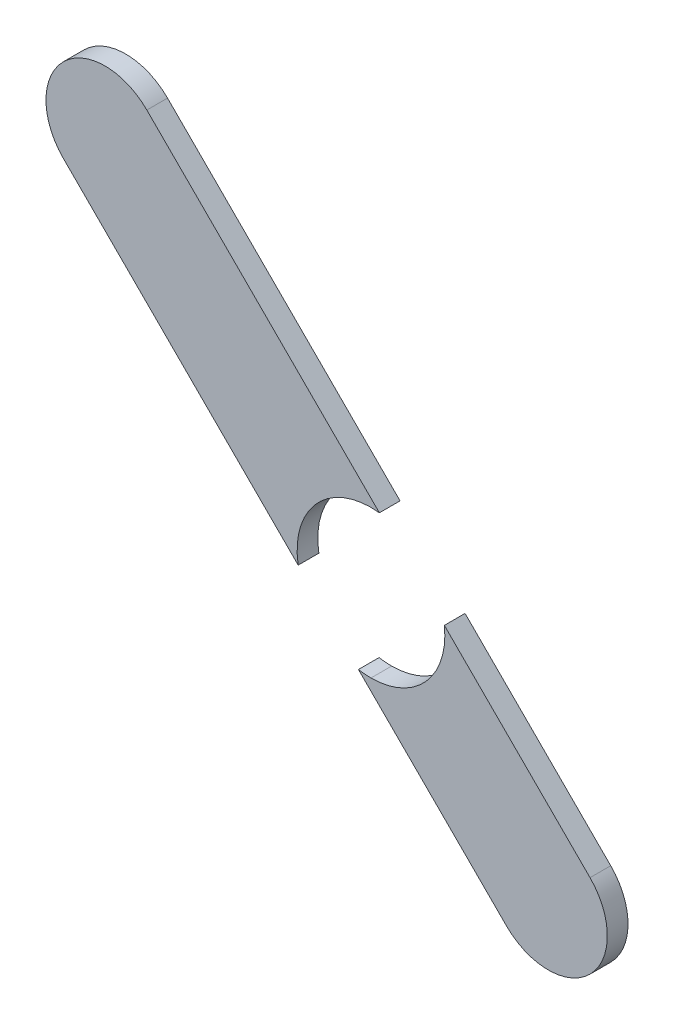
ISO-10303-21;
HEADER;
FILE_DESCRIPTION(('STEP AP214'),'2;1');
FILE_NAME('part.step','',(''),(''),'','','');
FILE_SCHEMA(('AUTOMOTIVE_DESIGN { 1 0 10303 214 1 1 1 1 }'));
ENDSEC;
DATA;
#1=APPLICATION_CONTEXT('core data for automotive mechanical design processes');
#2=APPLICATION_PROTOCOL_DEFINITION('international standard','automotive_design',2000,#1);
#3=PRODUCT_CONTEXT('',#1,'mechanical');
#4=PRODUCT('Part','Part','',(#3));
#5=PRODUCT_RELATED_PRODUCT_CATEGORY('part','',(#4));
#6=PRODUCT_DEFINITION_FORMATION('','',#4);
#7=PRODUCT_DEFINITION_CONTEXT('part definition',#1,'design');
#8=PRODUCT_DEFINITION('design','',#6,#7);
#9=PRODUCT_DEFINITION_SHAPE('','',#8);
#10=(LENGTH_UNIT() NAMED_UNIT(*) SI_UNIT(.MILLI.,.METRE.));
#11=(NAMED_UNIT(*) PLANE_ANGLE_UNIT() SI_UNIT($,.RADIAN.));
#12=(NAMED_UNIT(*) SI_UNIT($,.STERADIAN.) SOLID_ANGLE_UNIT());
#13=UNCERTAINTY_MEASURE_WITH_UNIT(LENGTH_MEASURE(1.E-05),#10,'distance_accuracy_value','');
#14=(GEOMETRIC_REPRESENTATION_CONTEXT(3) GLOBAL_UNCERTAINTY_ASSIGNED_CONTEXT((#13)) GLOBAL_UNIT_ASSIGNED_CONTEXT((#10,
#11,#12)) REPRESENTATION_CONTEXT('',''));
#15=CARTESIAN_POINT('',(0.,0.,0.));
#16=DIRECTION('',(0.,0.,1.));
#17=DIRECTION('',(1.,0.,0.));
#18=AXIS2_PLACEMENT_3D('',#15,#16,#17);
#19=CARTESIAN_POINT('',(150.5,-116.46,-0.045));
#20=DIRECTION('',(0.,0.,-1.));
#21=DIRECTION('',(0.,-1.,0.));
#22=AXIS2_PLACEMENT_3D('',#19,#20,#21);
#23=CYLINDRICAL_SURFACE('',#22,0.125);
#24=DIRECTION('',(0.,0.,1.));
#25=VECTOR('',#24,1.);
#26=CARTESIAN_POINT('',(150.5,-116.585,-0.045));
#27=LINE('',#26,#25);
#28=CARTESIAN_POINT('',(150.5,-116.585,1.6));
#29=VERTEX_POINT('',#28);
#30=CARTESIAN_POINT('',(150.5,-116.585,1.635));
#31=VERTEX_POINT('',#30);
#32=EDGE_CURVE('P0_E50',#29,#31,#27,.T.);
#33=ORIENTED_EDGE('',*,*,#32,.F.);
#34=CARTESIAN_POINT('',(150.5,-116.46,1.6));
#35=DIRECTION('',(0.,0.,-1.));
#36=DIRECTION('',(0.,-1.,0.));
#37=AXIS2_PLACEMENT_3D('',#34,#35,#36);
#38=CIRCLE('',#37,0.125);
#39=CARTESIAN_POINT('',(150.47876148928,-116.5831824892,1.6));
#40=VERTEX_POINT('',#39);
#41=EDGE_CURVE('P0_E91',#29,#40,#38,.T.);
#42=ORIENTED_EDGE('',*,*,#41,.T.);
#43=DIRECTION('',(0.,0.,-1.));
#44=VECTOR('',#43,1.);
#45=CARTESIAN_POINT('',(150.47876148926,-116.5831824892,-0.045));
#46=LINE('',#45,#44);
#47=CARTESIAN_POINT('',(150.47876148928,-116.5831824892,1.635));
#48=VERTEX_POINT('',#47);
#49=EDGE_CURVE('P0_E11',#48,#40,#46,.T.);
#50=ORIENTED_EDGE('',*,*,#49,.F.);
#51=CARTESIAN_POINT('',(150.5,-116.46,1.635));
#52=DIRECTION('',(0.,0.,-1.));
#53=DIRECTION('',(0.,-1.,0.));
#54=AXIS2_PLACEMENT_3D('',#51,#52,#53);
#55=CIRCLE('',#54,0.125);
#56=EDGE_CURVE('P0_E133',#31,#48,#55,.T.);
#57=ORIENTED_EDGE('',*,*,#56,.F.);
#58=EDGE_LOOP('',(#33,#42,#50,#57));
#59=FACE_BOUND('',#58,.T.);
#60=ADVANCED_FACE('P0_F17',(#59),#23,.F.);
#61=CARTESIAN_POINT('',(149.979289,-116.08371,1.6));
#62=DIRECTION('',(0.707106781186548,0.707106781186548,0.));
#63=DIRECTION('',(0.,0.,-1.));
#64=AXIS2_PLACEMENT_3D('',#61,#62,#63);
#65=PLANE('',#64);
#66=DIRECTION('',(0.,0.,1.));
#67=VECTOR('',#66,1.);
#68=CARTESIAN_POINT('',(150.729289,-116.83371,1.6));
#69=LINE('',#68,#67);
#70=CARTESIAN_POINT('',(150.729289,-116.83371,1.6));
#71=VERTEX_POINT('',#70);
#72=CARTESIAN_POINT('',(150.729289,-116.83371,1.635));
#73=VERTEX_POINT('',#72);
#74=EDGE_CURVE('P0_E27',#71,#73,#69,.T.);
#75=ORIENTED_EDGE('',*,*,#74,.T.);
#76=DIRECTION('',(0.707106781186548,-0.707106781186548,0.));
#77=VECTOR('',#76,1.);
#78=CARTESIAN_POINT('',(149.979289,-116.08371,1.635));
#79=LINE('',#78,#77);
#80=EDGE_CURVE('P0_E20',#48,#73,#79,.T.);
#81=ORIENTED_EDGE('',*,*,#80,.F.);
#82=ORIENTED_EDGE('',*,*,#49,.T.);
#83=DIRECTION('',(0.707106781186548,-0.707106781186548,0.));
#84=VECTOR('',#83,1.);
#85=CARTESIAN_POINT('',(149.979289,-116.08371,1.6));
#86=LINE('',#85,#84);
#87=EDGE_CURVE('P0_E105',#40,#71,#86,.T.);
#88=ORIENTED_EDGE('',*,*,#87,.T.);
#89=EDGE_LOOP('',(#75,#81,#82,#88));
#90=FACE_BOUND('',#89,.T.);
#91=ADVANCED_FACE('P0_F148',(#90),#65,.F.);
#92=CARTESIAN_POINT('',(150.7999995,-116.7629995,1.6));
#93=DIRECTION('',(0.,0.,-1.));
#94=DIRECTION('',(-0.707106781187048,-0.707106781186048,0.));
#95=AXIS2_PLACEMENT_3D('',#92,#93,#94);
#96=CYLINDRICAL_SURFACE('',#95,0.09999974810218);
#97=CARTESIAN_POINT('',(150.7999995,-116.7629995,1.6));
#98=DIRECTION('',(0.,0.,1.));
#99=DIRECTION('',(-0.707106781187048,-0.707106781186048,0.));
#100=AXIS2_PLACEMENT_3D('',#97,#98,#99);
#101=CIRCLE('',#100,0.09999974810218);
#102=CARTESIAN_POINT('',(150.87071,-116.692289,1.6));
#103=VERTEX_POINT('',#102);
#104=EDGE_CURVE('P0_E95',#71,#103,#101,.T.);
#105=ORIENTED_EDGE('',*,*,#104,.T.);
#106=DIRECTION('',(0.,0.,1.));
#107=VECTOR('',#106,1.);
#108=CARTESIAN_POINT('',(150.87071,-116.692289,1.6));
#109=LINE('',#108,#107);
#110=CARTESIAN_POINT('',(150.87071,-116.692289,1.635));
#111=VERTEX_POINT('',#110);
#112=EDGE_CURVE('P0_E103',#103,#111,#109,.T.);
#113=ORIENTED_EDGE('',*,*,#112,.T.);
#114=CARTESIAN_POINT('',(150.7999995,-116.7629995,1.635));
#115=DIRECTION('',(0.,0.,1.));
#116=DIRECTION('',(-0.707106781187048,-0.707106781186048,0.));
#117=AXIS2_PLACEMENT_3D('',#114,#115,#116);
#118=CIRCLE('',#117,0.09999974810218);
#119=EDGE_CURVE('P0_E130',#73,#111,#118,.T.);
#120=ORIENTED_EDGE('',*,*,#119,.F.);
#121=ORIENTED_EDGE('',*,*,#74,.F.);
#122=EDGE_LOOP('',(#105,#113,#120,#121));
#123=FACE_BOUND('',#122,.T.);
#124=ADVANCED_FACE('P0_F147',(#123),#96,.T.);
#125=CARTESIAN_POINT('',(150.87071,-116.692289,1.635));
#126=DIRECTION('',(0.,0.,1.));
#127=DIRECTION('',(1.,0.,0.));
#128=AXIS2_PLACEMENT_3D('',#125,#126,#127);
#129=PLANE('',#128);
#130=ORIENTED_EDGE('',*,*,#119,.T.);
#131=DIRECTION('',(-0.707106781186548,0.707106781186548,0.));
#132=VECTOR('',#131,1.);
#133=CARTESIAN_POINT('',(150.87071,-116.692289,1.635));
#134=LINE('',#133,#132);
#135=CARTESIAN_POINT('',(150.62418691946,-116.4457659194,1.635));
#136=VERTEX_POINT('',#135);
#137=EDGE_CURVE('P0_E112',#111,#136,#134,.T.);
#138=ORIENTED_EDGE('',*,*,#137,.T.);
#139=CARTESIAN_POINT('',(150.5,-116.46,1.635));
#140=DIRECTION('',(0.,0.,-1.));
#141=DIRECTION('',(0.,-1.,0.));
#142=AXIS2_PLACEMENT_3D('',#139,#140,#141);
#143=CIRCLE('',#142,0.125);
#144=EDGE_CURVE('P0_E109',#136,#31,#143,.T.);
#145=ORIENTED_EDGE('',*,*,#144,.T.);
#146=ORIENTED_EDGE('',*,*,#56,.T.);
#147=ORIENTED_EDGE('',*,*,#80,.T.);
#148=EDGE_LOOP('',(#130,#138,#145,#146,#147));
#149=FACE_BOUND('',#148,.T.);
#150=ADVANCED_FACE('P0_F146',(#149),#129,.T.);
#151=CARTESIAN_POINT('',(150.5,-116.46,-0.045));
#152=DIRECTION('',(0.,0.,-1.));
#153=DIRECTION('',(0.,-1.,0.));
#154=AXIS2_PLACEMENT_3D('',#151,#152,#153);
#155=CYLINDRICAL_SURFACE('',#154,0.125);
#156=CARTESIAN_POINT('',(150.5,-116.46,1.6));
#157=DIRECTION('',(0.,0.,-1.));
#158=DIRECTION('',(0.,-1.,0.));
#159=AXIS2_PLACEMENT_3D('',#156,#157,#158);
#160=CIRCLE('',#159,0.125);
#161=CARTESIAN_POINT('',(150.62418691946,-116.4457659194,1.6));
#162=VERTEX_POINT('',#161);
#163=EDGE_CURVE('P0_E85',#162,#29,#160,.T.);
#164=ORIENTED_EDGE('',*,*,#163,.T.);
#165=ORIENTED_EDGE('',*,*,#32,.T.);
#166=ORIENTED_EDGE('',*,*,#144,.F.);
#167=DIRECTION('',(0.,0.,-1.));
#168=VECTOR('',#167,1.);
#169=CARTESIAN_POINT('',(150.62418691939,-116.4457659193,-0.045));
#170=LINE('',#169,#168);
#171=EDGE_CURVE('P0_E101',#136,#162,#170,.T.);
#172=ORIENTED_EDGE('',*,*,#171,.T.);
#173=EDGE_LOOP('',(#164,#165,#166,#172));
#174=FACE_BOUND('',#173,.T.);
#175=ADVANCED_FACE('P0_F107',(#174),#155,.F.);
#176=CARTESIAN_POINT('',(150.87071,-116.692289,1.6));
#177=DIRECTION('',(0.,0.,1.));
#178=DIRECTION('',(1.,0.,0.));
#179=AXIS2_PLACEMENT_3D('',#176,#177,#178);
#180=PLANE('',#179);
#181=ORIENTED_EDGE('',*,*,#87,.F.);
#182=ORIENTED_EDGE('',*,*,#41,.F.);
#183=ORIENTED_EDGE('',*,*,#163,.F.);
#184=DIRECTION('',(-0.707106781186548,0.707106781186548,0.));
#185=VECTOR('',#184,1.);
#186=CARTESIAN_POINT('',(150.87071,-116.692289,1.6));
#187=LINE('',#186,#185);
#188=EDGE_CURVE('P0_E89',#103,#162,#187,.T.);
#189=ORIENTED_EDGE('',*,*,#188,.F.);
#190=ORIENTED_EDGE('',*,*,#104,.F.);
#191=EDGE_LOOP('',(#181,#182,#183,#189,#190));
#192=FACE_BOUND('',#191,.T.);
#193=ADVANCED_FACE('P0_F88',(#192),#180,.F.);
#194=CARTESIAN_POINT('',(150.87071,-116.692289,1.6));
#195=DIRECTION('',(-0.707106781186548,-0.707106781186548,0.));
#196=DIRECTION('',(-0.707106781186548,0.707106781186548,0.));
#197=AXIS2_PLACEMENT_3D('',#194,#195,#196);
#198=PLANE('',#197);
#199=ORIENTED_EDGE('',*,*,#171,.F.);
#200=ORIENTED_EDGE('',*,*,#137,.F.);
#201=ORIENTED_EDGE('',*,*,#112,.F.);
#202=ORIENTED_EDGE('',*,*,#188,.T.);
#203=EDGE_LOOP('',(#199,#200,#201,#202));
#204=FACE_BOUND('',#203,.T.);
#205=ADVANCED_FACE('P0_F99',(#204),#198,.F.);
#206=CLOSED_SHELL('',(#60,#91,#124,#150,#175,#193,#205));
#207=MANIFOLD_SOLID_BREP('P0_B1',#206);
#208=CARTESIAN_POINT('',(149.979289,-116.08371,1.6));
#209=DIRECTION('',(0.707106781186548,0.707106781186548,0.));
#210=DIRECTION('',(0.,0.,-1.));
#211=AXIS2_PLACEMENT_3D('',#208,#209,#210);
#212=PLANE('',#211);
#213=DIRECTION('',(0.,0.,-1.));
#214=VECTOR('',#213,1.);
#215=CARTESIAN_POINT('',(150.37681751073,-116.4812385107,-0.045));
#216=LINE('',#215,#214);
#217=CARTESIAN_POINT('',(150.37681751071,-116.4812385107,1.635));
#218=VERTEX_POINT('',#217);
#219=CARTESIAN_POINT('',(150.37681751071,-116.4812385107,1.6));
#220=VERTEX_POINT('',#219);
#221=EDGE_CURVE('P1_E11',#218,#220,#216,.T.);
#222=ORIENTED_EDGE('',*,*,#221,.F.);
#223=DIRECTION('',(0.707106781186548,-0.707106781186548,0.));
#224=VECTOR('',#223,1.);
#225=CARTESIAN_POINT('',(149.979289,-116.08371,1.635));
#226=LINE('',#225,#224);
#227=CARTESIAN_POINT('',(149.979289,-116.08371,1.635));
#228=VERTEX_POINT('',#227);
#229=EDGE_CURVE('P1_E25',#228,#218,#226,.T.);
#230=ORIENTED_EDGE('',*,*,#229,.F.);
#231=DIRECTION('',(0.,0.,1.));
#232=VECTOR('',#231,1.);
#233=CARTESIAN_POINT('',(149.979289,-116.08371,1.6));
#234=LINE('',#233,#232);
#235=CARTESIAN_POINT('',(149.979289,-116.08371,1.6));
#236=VERTEX_POINT('',#235);
#237=EDGE_CURVE('P1_E56',#236,#228,#234,.T.);
#238=ORIENTED_EDGE('',*,*,#237,.F.);
#239=DIRECTION('',(0.707106781186548,-0.707106781186548,0.));
#240=VECTOR('',#239,1.);
#241=CARTESIAN_POINT('',(149.979289,-116.08371,1.6));
#242=LINE('',#241,#240);
#243=EDGE_CURVE('P1_E59',#236,#220,#242,.T.);
#244=ORIENTED_EDGE('',*,*,#243,.T.);
#245=EDGE_LOOP('',(#222,#230,#238,#244));
#246=FACE_BOUND('',#245,.T.);
#247=ADVANCED_FACE('P1_F17',(#246),#212,.F.);
#248=CARTESIAN_POINT('',(150.5,-116.46,-0.045));
#249=DIRECTION('',(0.,0.,-1.));
#250=DIRECTION('',(0.,-1.,0.));
#251=AXIS2_PLACEMENT_3D('',#248,#249,#250);
#252=CYLINDRICAL_SURFACE('',#251,0.125);
#253=DIRECTION('',(0.,0.,-1.));
#254=VECTOR('',#253,1.);
#255=CARTESIAN_POINT('',(150.5142340806,-116.3358130806,-0.045));
#256=LINE('',#255,#254);
#257=CARTESIAN_POINT('',(150.51423408053,-116.3358130805,1.635));
#258=VERTEX_POINT('',#257);
#259=CARTESIAN_POINT('',(150.51423408053,-116.3358130805,1.6));
#260=VERTEX_POINT('',#259);
#261=EDGE_CURVE('P1_E87',#258,#260,#256,.T.);
#262=ORIENTED_EDGE('',*,*,#261,.F.);
#263=CARTESIAN_POINT('',(150.5,-116.46,1.635));
#264=DIRECTION('',(0.,0.,-1.));
#265=DIRECTION('',(0.,-1.,0.));
#266=AXIS2_PLACEMENT_3D('',#263,#264,#265);
#267=CIRCLE('',#266,0.125);
#268=EDGE_CURVE('P1_E92',#218,#258,#267,.T.);
#269=ORIENTED_EDGE('',*,*,#268,.F.);
#270=ORIENTED_EDGE('',*,*,#221,.T.);
#271=CARTESIAN_POINT('',(150.5,-116.46,1.6));
#272=DIRECTION('',(0.,0.,-1.));
#273=DIRECTION('',(0.,-1.,0.));
#274=AXIS2_PLACEMENT_3D('',#271,#272,#273);
#275=CIRCLE('',#274,0.125);
#276=EDGE_CURVE('P1_E64',#220,#260,#275,.T.);
#277=ORIENTED_EDGE('',*,*,#276,.T.);
#278=EDGE_LOOP('',(#262,#269,#270,#277));
#279=FACE_BOUND('',#278,.T.);
#280=ADVANCED_FACE('P1_F104',(#279),#252,.F.);
#281=CARTESIAN_POINT('',(150.87071,-116.692289,1.635));
#282=DIRECTION('',(0.,0.,1.));
#283=DIRECTION('',(1.,0.,0.));
#284=AXIS2_PLACEMENT_3D('',#281,#282,#283);
#285=PLANE('',#284);
#286=ORIENTED_EDGE('',*,*,#268,.T.);
#287=DIRECTION('',(-0.707106781186548,0.707106781186548,0.));
#288=VECTOR('',#287,1.);
#289=CARTESIAN_POINT('',(150.87071,-116.692289,1.635));
#290=LINE('',#289,#288);
#291=CARTESIAN_POINT('',(150.12071,-115.942289,1.635));
#292=VERTEX_POINT('',#291);
#293=EDGE_CURVE('P1_E110',#258,#292,#290,.T.);
#294=ORIENTED_EDGE('',*,*,#293,.T.);
#295=CARTESIAN_POINT('',(150.0499995,-116.0129995,1.635));
#296=DIRECTION('',(0.,0.,1.));
#297=DIRECTION('',(0.707106781186048,0.707106781187047,0.));
#298=AXIS2_PLACEMENT_3D('',#295,#296,#297);
#299=CIRCLE('',#298,0.09999974810219);
#300=EDGE_CURVE('P1_E63',#292,#228,#299,.T.);
#301=ORIENTED_EDGE('',*,*,#300,.T.);
#302=ORIENTED_EDGE('',*,*,#229,.T.);
#303=EDGE_LOOP('',(#286,#294,#301,#302));
#304=FACE_BOUND('',#303,.T.);
#305=ADVANCED_FACE('P1_F100',(#304),#285,.T.);
#306=CARTESIAN_POINT('',(150.0499995,-116.0129995,1.6));
#307=DIRECTION('',(0.,0.,-1.));
#308=DIRECTION('',(0.707106781186048,0.707106781187048,0.));
#309=AXIS2_PLACEMENT_3D('',#306,#307,#308);
#310=CYLINDRICAL_SURFACE('',#309,0.09999974810219);
#311=CARTESIAN_POINT('',(150.0499995,-116.0129995,1.6));
#312=DIRECTION('',(0.,0.,1.));
#313=DIRECTION('',(0.707106781186048,0.707106781187047,0.));
#314=AXIS2_PLACEMENT_3D('',#311,#312,#313);
#315=CIRCLE('',#314,0.09999974810219);
#316=CARTESIAN_POINT('',(150.12071,-115.942289,1.6));
#317=VERTEX_POINT('',#316);
#318=EDGE_CURVE('P1_E68',#317,#236,#315,.T.);
#319=ORIENTED_EDGE('',*,*,#318,.T.);
#320=ORIENTED_EDGE('',*,*,#237,.T.);
#321=ORIENTED_EDGE('',*,*,#300,.F.);
#322=DIRECTION('',(0.,0.,1.));
#323=VECTOR('',#322,1.);
#324=CARTESIAN_POINT('',(150.12071,-115.942289,1.6));
#325=LINE('',#324,#323);
#326=EDGE_CURVE('P1_E72',#317,#292,#325,.T.);
#327=ORIENTED_EDGE('',*,*,#326,.F.);
#328=EDGE_LOOP('',(#319,#320,#321,#327));
#329=FACE_BOUND('',#328,.T.);
#330=ADVANCED_FACE('P1_F69',(#329),#310,.T.);
#331=CARTESIAN_POINT('',(150.87071,-116.692289,1.6));
#332=DIRECTION('',(0.,0.,1.));
#333=DIRECTION('',(1.,0.,0.));
#334=AXIS2_PLACEMENT_3D('',#331,#332,#333);
#335=PLANE('',#334);
#336=ORIENTED_EDGE('',*,*,#243,.F.);
#337=ORIENTED_EDGE('',*,*,#318,.F.);
#338=DIRECTION('',(-0.707106781186548,0.707106781186548,0.));
#339=VECTOR('',#338,1.);
#340=CARTESIAN_POINT('',(150.87071,-116.692289,1.6));
#341=LINE('',#340,#339);
#342=EDGE_CURVE('P1_E81',#260,#317,#341,.T.);
#343=ORIENTED_EDGE('',*,*,#342,.F.);
#344=ORIENTED_EDGE('',*,*,#276,.F.);
#345=EDGE_LOOP('',(#336,#337,#343,#344));
#346=FACE_BOUND('',#345,.T.);
#347=ADVANCED_FACE('P1_F79',(#346),#335,.F.);
#348=CARTESIAN_POINT('',(150.87071,-116.692289,1.6));
#349=DIRECTION('',(-0.707106781186548,-0.707106781186548,0.));
#350=DIRECTION('',(-0.707106781186548,0.707106781186548,0.));
#351=AXIS2_PLACEMENT_3D('',#348,#349,#350);
#352=PLANE('',#351);
#353=ORIENTED_EDGE('',*,*,#326,.T.);
#354=ORIENTED_EDGE('',*,*,#293,.F.);
#355=ORIENTED_EDGE('',*,*,#261,.T.);
#356=ORIENTED_EDGE('',*,*,#342,.T.);
#357=EDGE_LOOP('',(#353,#354,#355,#356));
#358=FACE_BOUND('',#357,.T.);
#359=ADVANCED_FACE('P1_F112',(#358),#352,.F.);
#360=CLOSED_SHELL('',(#247,#280,#305,#330,#347,#359));
#361=MANIFOLD_SOLID_BREP('P1_B1',#360);
#362=ADVANCED_BREP_SHAPE_REPRESENTATION('',(#18,#207,#361),#14);
#363=SHAPE_DEFINITION_REPRESENTATION(#9,#362);
ENDSEC;
END-ISO-10303-21;
